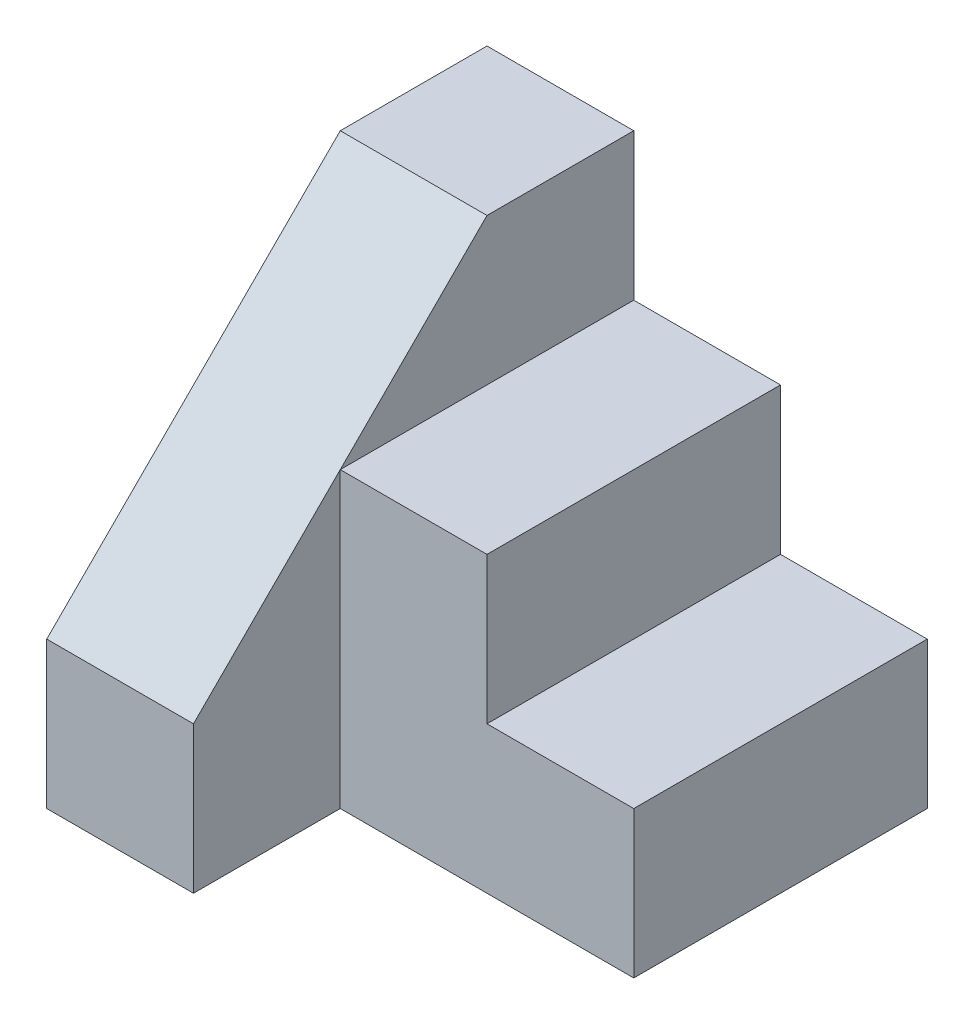
ISO-10303-21;
HEADER;
FILE_DESCRIPTION(('STEP AP214'),'2;1');
FILE_NAME('part.step','',(''),(''),'','','');
FILE_SCHEMA(('AUTOMOTIVE_DESIGN { 1 0 10303 214 1 1 1 1 }'));
ENDSEC;
DATA;
#1=APPLICATION_CONTEXT('core data for automotive mechanical design processes');
#2=APPLICATION_PROTOCOL_DEFINITION('international standard','automotive_design',2000,#1);
#3=PRODUCT_CONTEXT('',#1,'mechanical');
#4=PRODUCT('Part','Part','',(#3));
#5=PRODUCT_RELATED_PRODUCT_CATEGORY('part','',(#4));
#6=PRODUCT_DEFINITION_FORMATION('','',#4);
#7=PRODUCT_DEFINITION_CONTEXT('part definition',#1,'design');
#8=PRODUCT_DEFINITION('design','',#6,#7);
#9=PRODUCT_DEFINITION_SHAPE('','',#8);
#10=(LENGTH_UNIT() NAMED_UNIT(*) SI_UNIT(.MILLI.,.METRE.));
#11=(NAMED_UNIT(*) PLANE_ANGLE_UNIT() SI_UNIT($,.RADIAN.));
#12=(NAMED_UNIT(*) SI_UNIT($,.STERADIAN.) SOLID_ANGLE_UNIT());
#13=UNCERTAINTY_MEASURE_WITH_UNIT(LENGTH_MEASURE(1.E-05),#10,'distance_accuracy_value','');
#14=(GEOMETRIC_REPRESENTATION_CONTEXT(3) GLOBAL_UNCERTAINTY_ASSIGNED_CONTEXT((#13)) GLOBAL_UNIT_ASSIGNED_CONTEXT((#10,
#11,#12)) REPRESENTATION_CONTEXT('',''));
#15=CARTESIAN_POINT('',(0.,0.,0.));
#16=DIRECTION('',(0.,0.,1.));
#17=DIRECTION('',(1.,0.,0.));
#18=AXIS2_PLACEMENT_3D('',#15,#16,#17);
#19=CARTESIAN_POINT('',(0.,30.,-30.));
#20=DIRECTION('',(0.,1.,0.));
#21=DIRECTION('',(0.,0.,1.));
#22=AXIS2_PLACEMENT_3D('',#19,#20,#21);
#23=PLANE('',#22);
#24=DIRECTION('',(0.,0.,1.));
#25=VECTOR('',#24,1.);
#26=CARTESIAN_POINT('',(0.,30.,-30.));
#27=LINE('',#26,#25);
#28=CARTESIAN_POINT('',(0.,30.,-30.));
#29=VERTEX_POINT('',#28);
#30=CARTESIAN_POINT('',(0.,30.,-20.));
#31=VERTEX_POINT('',#30);
#32=EDGE_CURVE('E41',#29,#31,#27,.T.);
#33=ORIENTED_EDGE('',*,*,#32,.T.);
#34=DIRECTION('',(1.,0.,0.));
#35=VECTOR('',#34,1.);
#36=CARTESIAN_POINT('',(0.,30.,-20.));
#37=LINE('',#36,#35);
#38=CARTESIAN_POINT('',(10.,30.,-20.));
#39=VERTEX_POINT('',#38);
#40=EDGE_CURVE('E108',#31,#39,#37,.T.);
#41=ORIENTED_EDGE('',*,*,#40,.T.);
#42=DIRECTION('',(0.,0.,1.));
#43=VECTOR('',#42,1.);
#44=CARTESIAN_POINT('',(10.,30.,-30.));
#45=LINE('',#44,#43);
#46=CARTESIAN_POINT('',(10.,30.,-30.));
#47=VERTEX_POINT('',#46);
#48=EDGE_CURVE('E144',#47,#39,#45,.T.);
#49=ORIENTED_EDGE('',*,*,#48,.F.);
#50=DIRECTION('',(-1.,0.,0.));
#51=VECTOR('',#50,1.);
#52=CARTESIAN_POINT('',(0.,30.,-30.));
#53=LINE('',#52,#51);
#54=EDGE_CURVE('E128',#47,#29,#53,.T.);
#55=ORIENTED_EDGE('',*,*,#54,.T.);
#56=EDGE_LOOP('',(#33,#41,#49,#55));
#57=FACE_BOUND('',#56,.T.);
#58=ADVANCED_FACE('F33',(#57),#23,.T.);
#59=CARTESIAN_POINT('',(0.,0.,0.));
#60=DIRECTION('',(0.,0.,-1.));
#61=DIRECTION('',(-1.,0.,0.));
#62=AXIS2_PLACEMENT_3D('',#59,#60,#61);
#63=PLANE('',#62);
#64=DIRECTION('',(1.,0.,0.));
#65=VECTOR('',#64,1.);
#66=CARTESIAN_POINT('',(0.,10.,0.));
#67=LINE('',#66,#65);
#68=CARTESIAN_POINT('',(0.,10.,0.));
#69=VERTEX_POINT('',#68);
#70=CARTESIAN_POINT('',(10.,10.,0.));
#71=VERTEX_POINT('',#70);
#72=EDGE_CURVE('E48',#69,#71,#67,.T.);
#73=ORIENTED_EDGE('',*,*,#72,.F.);
#74=DIRECTION('',(0.,-1.,0.));
#75=VECTOR('',#74,1.);
#76=CARTESIAN_POINT('',(0.,0.,0.));
#77=LINE('',#76,#75);
#78=CARTESIAN_POINT('',(0.,0.,0.));
#79=VERTEX_POINT('',#78);
#80=EDGE_CURVE('E125',#69,#79,#77,.T.);
#81=ORIENTED_EDGE('',*,*,#80,.T.);
#82=DIRECTION('',(1.,0.,0.));
#83=VECTOR('',#82,1.);
#84=CARTESIAN_POINT('',(0.,0.,0.));
#85=LINE('',#84,#83);
#86=CARTESIAN_POINT('',(10.,0.,0.));
#87=VERTEX_POINT('',#86);
#88=EDGE_CURVE('E135',#79,#87,#85,.T.);
#89=ORIENTED_EDGE('',*,*,#88,.T.);
#90=DIRECTION('',(0.,1.,0.));
#91=VECTOR('',#90,1.);
#92=CARTESIAN_POINT('',(10.,0.,0.));
#93=LINE('',#92,#91);
#94=EDGE_CURVE('E155',#87,#71,#93,.T.);
#95=ORIENTED_EDGE('',*,*,#94,.T.);
#96=EDGE_LOOP('',(#73,#81,#89,#95));
#97=FACE_BOUND('',#96,.T.);
#98=ADVANCED_FACE('F221',(#97),#63,.F.);
#99=CARTESIAN_POINT('',(0.,0.,-30.));
#100=DIRECTION('',(-1.,0.,0.));
#101=DIRECTION('',(0.,0.,1.));
#102=AXIS2_PLACEMENT_3D('',#99,#100,#101);
#103=PLANE('',#102);
#104=ORIENTED_EDGE('',*,*,#80,.F.);
#105=DIRECTION('',(0.,-0.707106781186548,0.707106781186548));
#106=VECTOR('',#105,1.);
#107=CARTESIAN_POINT('',(0.,5.,5.));
#108=LINE('',#107,#106);
#109=EDGE_CURVE('E111',#31,#69,#108,.T.);
#110=ORIENTED_EDGE('',*,*,#109,.F.);
#111=ORIENTED_EDGE('',*,*,#32,.F.);
#112=DIRECTION('',(0.,-1.,0.));
#113=VECTOR('',#112,1.);
#114=CARTESIAN_POINT('',(0.,0.,-30.));
#115=LINE('',#114,#113);
#116=CARTESIAN_POINT('',(0.,0.,-30.));
#117=VERTEX_POINT('',#116);
#118=EDGE_CURVE('E147',#29,#117,#115,.T.);
#119=ORIENTED_EDGE('',*,*,#118,.T.);
#120=DIRECTION('',(0.,0.,1.));
#121=VECTOR('',#120,1.);
#122=CARTESIAN_POINT('',(0.,0.,-30.));
#123=LINE('',#122,#121);
#124=EDGE_CURVE('E132',#117,#79,#123,.T.);
#125=ORIENTED_EDGE('',*,*,#124,.T.);
#126=EDGE_LOOP('',(#104,#110,#111,#119,#125));
#127=FACE_BOUND('',#126,.T.);
#128=ADVANCED_FACE('F35',(#127),#103,.T.);
#129=CARTESIAN_POINT('',(10.,0.,-30.));
#130=DIRECTION('',(1.,0.,0.));
#131=DIRECTION('',(0.,0.,-1.));
#132=AXIS2_PLACEMENT_3D('',#129,#130,#131);
#133=PLANE('',#132);
#134=ORIENTED_EDGE('',*,*,#48,.T.);
#135=DIRECTION('',(0.,-0.707106781186548,0.707106781186548));
#136=VECTOR('',#135,1.);
#137=CARTESIAN_POINT('',(10.,20.,-10.));
#138=LINE('',#137,#136);
#139=CARTESIAN_POINT('',(10.,20.,-10.));
#140=VERTEX_POINT('',#139);
#141=EDGE_CURVE('E113',#39,#140,#138,.T.);
#142=ORIENTED_EDGE('',*,*,#141,.T.);
#143=DIRECTION('',(0.,0.,1.));
#144=VECTOR('',#143,1.);
#145=CARTESIAN_POINT('',(10.,20.,-30.));
#146=LINE('',#145,#144);
#147=CARTESIAN_POINT('',(10.,20.,-30.));
#148=VERTEX_POINT('',#147);
#149=EDGE_CURVE('E163',#148,#140,#146,.T.);
#150=ORIENTED_EDGE('',*,*,#149,.F.);
#151=DIRECTION('',(0.,1.,0.));
#152=VECTOR('',#151,1.);
#153=CARTESIAN_POINT('',(10.,0.,-30.));
#154=LINE('',#153,#152);
#155=EDGE_CURVE('E195',#148,#47,#154,.T.);
#156=ORIENTED_EDGE('',*,*,#155,.T.);
#157=EDGE_LOOP('',(#134,#142,#150,#156));
#158=FACE_BOUND('',#157,.T.);
#159=ADVANCED_FACE('F239',(#158),#133,.T.);
#160=DIRECTION('',(0.,1.,0.));
#161=VECTOR('',#160,1.);
#162=CARTESIAN_POINT('',(10.,0.,-10.));
#163=LINE('',#162,#161);
#164=CARTESIAN_POINT('',(10.,0.,-10.));
#165=VERTEX_POINT('',#164);
#166=EDGE_CURVE('E184',#165,#140,#163,.T.);
#167=ORIENTED_EDGE('',*,*,#166,.T.);
#168=EDGE_CURVE('E250',#140,#71,#138,.T.);
#169=ORIENTED_EDGE('',*,*,#168,.T.);
#170=ORIENTED_EDGE('',*,*,#94,.F.);
#171=DIRECTION('',(0.,0.,1.));
#172=VECTOR('',#171,1.);
#173=CARTESIAN_POINT('',(10.,0.,0.));
#174=LINE('',#173,#172);
#175=EDGE_CURVE('E185',#165,#87,#174,.T.);
#176=ORIENTED_EDGE('',*,*,#175,.F.);
#177=EDGE_LOOP('',(#167,#169,#170,#176));
#178=FACE_BOUND('',#177,.T.);
#179=ADVANCED_FACE('F241',(#178),#133,.T.);
#180=CARTESIAN_POINT('',(0.,0.,-30.));
#181=DIRECTION('',(0.,0.,-1.));
#182=DIRECTION('',(-1.,0.,0.));
#183=AXIS2_PLACEMENT_3D('',#180,#181,#182);
#184=PLANE('',#183);
#185=ORIENTED_EDGE('',*,*,#54,.F.);
#186=ORIENTED_EDGE('',*,*,#155,.F.);
#187=DIRECTION('',(1.,0.,0.));
#188=VECTOR('',#187,1.);
#189=CARTESIAN_POINT('',(0.,20.,-30.));
#190=LINE('',#189,#188);
#191=CARTESIAN_POINT('',(20.,20.,-30.));
#192=VERTEX_POINT('',#191);
#193=EDGE_CURVE('E197',#148,#192,#190,.T.);
#194=ORIENTED_EDGE('',*,*,#193,.T.);
#195=DIRECTION('',(0.,-1.,0.));
#196=VECTOR('',#195,1.);
#197=CARTESIAN_POINT('',(20.,0.,-30.));
#198=LINE('',#197,#196);
#199=CARTESIAN_POINT('',(20.,10.,-30.));
#200=VERTEX_POINT('',#199);
#201=EDGE_CURVE('E200',#192,#200,#198,.T.);
#202=ORIENTED_EDGE('',*,*,#201,.T.);
#203=DIRECTION('',(1.,0.,0.));
#204=VECTOR('',#203,1.);
#205=CARTESIAN_POINT('',(0.,10.,-30.));
#206=LINE('',#205,#204);
#207=CARTESIAN_POINT('',(30.,10.,-30.));
#208=VERTEX_POINT('',#207);
#209=EDGE_CURVE('E166',#200,#208,#206,.T.);
#210=ORIENTED_EDGE('',*,*,#209,.T.);
#211=DIRECTION('',(0.,1.,0.));
#212=VECTOR('',#211,1.);
#213=CARTESIAN_POINT('',(30.,0.,-30.));
#214=LINE('',#213,#212);
#215=CARTESIAN_POINT('',(30.,0.,-30.));
#216=VERTEX_POINT('',#215);
#217=EDGE_CURVE('E138',#216,#208,#214,.T.);
#218=ORIENTED_EDGE('',*,*,#217,.F.);
#219=DIRECTION('',(1.,0.,0.));
#220=VECTOR('',#219,1.);
#221=CARTESIAN_POINT('',(0.,0.,-30.));
#222=LINE('',#221,#220);
#223=EDGE_CURVE('E141',#117,#216,#222,.T.);
#224=ORIENTED_EDGE('',*,*,#223,.F.);
#225=ORIENTED_EDGE('',*,*,#118,.F.);
#226=EDGE_LOOP('',(#185,#186,#194,#202,#210,#218,#224,#225));
#227=FACE_BOUND('',#226,.T.);
#228=ADVANCED_FACE('F175',(#227),#184,.T.);
#229=CARTESIAN_POINT('',(30.,0.,-30.));
#230=DIRECTION('',(1.,0.,0.));
#231=DIRECTION('',(0.,0.,-1.));
#232=AXIS2_PLACEMENT_3D('',#229,#230,#231);
#233=PLANE('',#232);
#234=DIRECTION('',(0.,1.,0.));
#235=VECTOR('',#234,1.);
#236=CARTESIAN_POINT('',(30.,0.,-10.));
#237=LINE('',#236,#235);
#238=CARTESIAN_POINT('',(30.,0.,-10.));
#239=VERTEX_POINT('',#238);
#240=CARTESIAN_POINT('',(30.,10.,-10.));
#241=VERTEX_POINT('',#240);
#242=EDGE_CURVE('E182',#239,#241,#237,.T.);
#243=ORIENTED_EDGE('',*,*,#242,.F.);
#244=DIRECTION('',(0.,0.,1.));
#245=VECTOR('',#244,1.);
#246=CARTESIAN_POINT('',(30.,0.,-30.));
#247=LINE('',#246,#245);
#248=EDGE_CURVE('E129',#216,#239,#247,.T.);
#249=ORIENTED_EDGE('',*,*,#248,.F.);
#250=ORIENTED_EDGE('',*,*,#217,.T.);
#251=DIRECTION('',(0.,0.,1.));
#252=VECTOR('',#251,1.);
#253=CARTESIAN_POINT('',(30.,10.,-30.));
#254=LINE('',#253,#252);
#255=EDGE_CURVE('E148',#208,#241,#254,.T.);
#256=ORIENTED_EDGE('',*,*,#255,.T.);
#257=EDGE_LOOP('',(#243,#249,#250,#256));
#258=FACE_BOUND('',#257,.T.);
#259=ADVANCED_FACE('F181',(#258),#233,.T.);
#260=CARTESIAN_POINT('',(0.,0.,-30.));
#261=DIRECTION('',(0.,-1.,0.));
#262=DIRECTION('',(0.,0.,-1.));
#263=AXIS2_PLACEMENT_3D('',#260,#261,#262);
#264=PLANE('',#263);
#265=ORIENTED_EDGE('',*,*,#175,.T.);
#266=ORIENTED_EDGE('',*,*,#88,.F.);
#267=ORIENTED_EDGE('',*,*,#124,.F.);
#268=ORIENTED_EDGE('',*,*,#223,.T.);
#269=ORIENTED_EDGE('',*,*,#248,.T.);
#270=DIRECTION('',(-1.,0.,0.));
#271=VECTOR('',#270,1.);
#272=CARTESIAN_POINT('',(30.,0.,-10.));
#273=LINE('',#272,#271);
#274=EDGE_CURVE('E189',#239,#165,#273,.T.);
#275=ORIENTED_EDGE('',*,*,#274,.T.);
#276=EDGE_LOOP('',(#265,#266,#267,#268,#269,#275));
#277=FACE_BOUND('',#276,.T.);
#278=ADVANCED_FACE('F171',(#277),#264,.T.);
#279=CARTESIAN_POINT('',(0.,10.,-30.));
#280=DIRECTION('',(0.,-1.,0.));
#281=DIRECTION('',(0.,0.,-1.));
#282=AXIS2_PLACEMENT_3D('',#279,#280,#281);
#283=PLANE('',#282);
#284=DIRECTION('',(0.,0.,1.));
#285=VECTOR('',#284,1.);
#286=CARTESIAN_POINT('',(20.,10.,-30.));
#287=LINE('',#286,#285);
#288=CARTESIAN_POINT('',(20.,10.,-10.));
#289=VERTEX_POINT('',#288);
#290=EDGE_CURVE('E152',#200,#289,#287,.T.);
#291=ORIENTED_EDGE('',*,*,#290,.T.);
#292=DIRECTION('',(1.,0.,0.));
#293=VECTOR('',#292,1.);
#294=CARTESIAN_POINT('',(0.,10.,-10.));
#295=LINE('',#294,#293);
#296=EDGE_CURVE('E193',#289,#241,#295,.T.);
#297=ORIENTED_EDGE('',*,*,#296,.T.);
#298=ORIENTED_EDGE('',*,*,#255,.F.);
#299=ORIENTED_EDGE('',*,*,#209,.F.);
#300=EDGE_LOOP('',(#291,#297,#298,#299));
#301=FACE_BOUND('',#300,.T.);
#302=ADVANCED_FACE('F207',(#301),#283,.F.);
#303=CARTESIAN_POINT('',(20.,0.,-30.));
#304=DIRECTION('',(-1.,0.,0.));
#305=DIRECTION('',(0.,-1.,0.));
#306=AXIS2_PLACEMENT_3D('',#303,#304,#305);
#307=PLANE('',#306);
#308=DIRECTION('',(0.,0.,1.));
#309=VECTOR('',#308,1.);
#310=CARTESIAN_POINT('',(20.,20.,-30.));
#311=LINE('',#310,#309);
#312=CARTESIAN_POINT('',(20.,20.,-10.));
#313=VERTEX_POINT('',#312);
#314=EDGE_CURVE('E160',#192,#313,#311,.T.);
#315=ORIENTED_EDGE('',*,*,#314,.T.);
#316=DIRECTION('',(0.,-1.,0.));
#317=VECTOR('',#316,1.);
#318=CARTESIAN_POINT('',(20.,0.,-10.));
#319=LINE('',#318,#317);
#320=EDGE_CURVE('E56',#313,#289,#319,.T.);
#321=ORIENTED_EDGE('',*,*,#320,.T.);
#322=ORIENTED_EDGE('',*,*,#290,.F.);
#323=ORIENTED_EDGE('',*,*,#201,.F.);
#324=EDGE_LOOP('',(#315,#321,#322,#323));
#325=FACE_BOUND('',#324,.T.);
#326=ADVANCED_FACE('F205',(#325),#307,.F.);
#327=CARTESIAN_POINT('',(0.,20.,-30.));
#328=DIRECTION('',(0.,-1.,0.));
#329=DIRECTION('',(0.,0.,-1.));
#330=AXIS2_PLACEMENT_3D('',#327,#328,#329);
#331=PLANE('',#330);
#332=ORIENTED_EDGE('',*,*,#149,.T.);
#333=DIRECTION('',(1.,0.,0.));
#334=VECTOR('',#333,1.);
#335=CARTESIAN_POINT('',(0.,20.,-10.));
#336=LINE('',#335,#334);
#337=EDGE_CURVE('E11',#140,#313,#336,.T.);
#338=ORIENTED_EDGE('',*,*,#337,.T.);
#339=ORIENTED_EDGE('',*,*,#314,.F.);
#340=ORIENTED_EDGE('',*,*,#193,.F.);
#341=EDGE_LOOP('',(#332,#338,#339,#340));
#342=FACE_BOUND('',#341,.T.);
#343=ADVANCED_FACE('F210',(#342),#331,.F.);
#344=CARTESIAN_POINT('',(30.,0.,-10.));
#345=DIRECTION('',(0.,0.,-1.));
#346=DIRECTION('',(-1.,0.,0.));
#347=AXIS2_PLACEMENT_3D('',#344,#345,#346);
#348=PLANE('',#347);
#349=ORIENTED_EDGE('',*,*,#320,.F.);
#350=ORIENTED_EDGE('',*,*,#337,.F.);
#351=ORIENTED_EDGE('',*,*,#166,.F.);
#352=ORIENTED_EDGE('',*,*,#274,.F.);
#353=ORIENTED_EDGE('',*,*,#242,.T.);
#354=ORIENTED_EDGE('',*,*,#296,.F.);
#355=EDGE_LOOP('',(#349,#350,#351,#352,#353,#354));
#356=FACE_BOUND('',#355,.T.);
#357=ADVANCED_FACE('F208',(#356),#348,.F.);
#358=CARTESIAN_POINT('',(0.,5.,5.));
#359=DIRECTION('',(0.,0.707106781186547,0.707106781186547));
#360=DIRECTION('',(0.,-0.707106781186548,0.707106781186548));
#361=AXIS2_PLACEMENT_3D('',#358,#359,#360);
#362=PLANE('',#361);
#363=ORIENTED_EDGE('',*,*,#40,.F.);
#364=ORIENTED_EDGE('',*,*,#109,.T.);
#365=ORIENTED_EDGE('',*,*,#72,.T.);
#366=ORIENTED_EDGE('',*,*,#168,.F.);
#367=ORIENTED_EDGE('',*,*,#141,.F.);
#368=EDGE_LOOP('',(#363,#364,#365,#366,#367));
#369=FACE_BOUND('',#368,.T.);
#370=ADVANCED_FACE('F110',(#369),#362,.T.);
#371=CLOSED_SHELL('',(#58,#98,#128,#159,#179,#228,#259,#278,#302,#326,#343,#357,#370));
#372=MANIFOLD_SOLID_BREP('B2',#371);
#373=ADVANCED_BREP_SHAPE_REPRESENTATION('',(#18,#372),#14);
#374=SHAPE_DEFINITION_REPRESENTATION(#9,#373);
ENDSEC;
END-ISO-10303-21;
